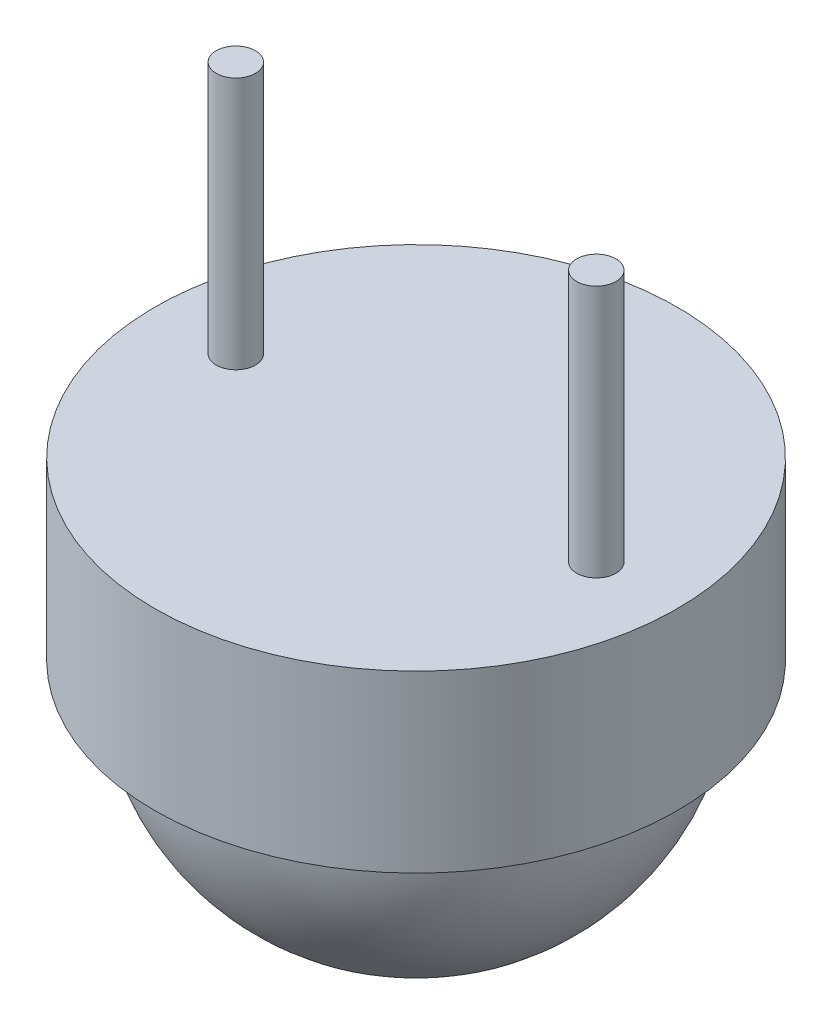
ISO-10303-21;
HEADER;
FILE_DESCRIPTION(('STEP AP214'),'2;1');
FILE_NAME('part.step','',(''),(''),'','','');
FILE_SCHEMA(('AUTOMOTIVE_DESIGN { 1 0 10303 214 1 1 1 1 }'));
ENDSEC;
DATA;
#1=APPLICATION_CONTEXT('core data for automotive mechanical design processes');
#2=APPLICATION_PROTOCOL_DEFINITION('international standard','automotive_design',2000,#1);
#3=PRODUCT_CONTEXT('',#1,'mechanical');
#4=PRODUCT('Part','Part','',(#3));
#5=PRODUCT_RELATED_PRODUCT_CATEGORY('part','',(#4));
#6=PRODUCT_DEFINITION_FORMATION('','',#4);
#7=PRODUCT_DEFINITION_CONTEXT('part definition',#1,'design');
#8=PRODUCT_DEFINITION('design','',#6,#7);
#9=PRODUCT_DEFINITION_SHAPE('','',#8);
#10=(LENGTH_UNIT() NAMED_UNIT(*) SI_UNIT(.MILLI.,.METRE.));
#11=(NAMED_UNIT(*) PLANE_ANGLE_UNIT() SI_UNIT($,.RADIAN.));
#12=(NAMED_UNIT(*) SI_UNIT($,.STERADIAN.) SOLID_ANGLE_UNIT());
#13=UNCERTAINTY_MEASURE_WITH_UNIT(LENGTH_MEASURE(1.E-05),#10,'distance_accuracy_value','');
#14=(GEOMETRIC_REPRESENTATION_CONTEXT(3) GLOBAL_UNCERTAINTY_ASSIGNED_CONTEXT((#13)) GLOBAL_UNIT_ASSIGNED_CONTEXT((#10,
#11,#12)) REPRESENTATION_CONTEXT('',''));
#15=CARTESIAN_POINT('',(0.,0.,0.));
#16=DIRECTION('',(0.,0.,1.));
#17=DIRECTION('',(1.,0.,0.));
#18=AXIS2_PLACEMENT_3D('',#15,#16,#17);
#19=CARTESIAN_POINT('',(0.,7.4,0.));
#20=DIRECTION('',(0.,-1.,0.));
#21=DIRECTION('',(0.,0.,-1.));
#22=AXIS2_PLACEMENT_3D('',#19,#20,#21);
#23=CYLINDRICAL_SURFACE('',#22,11.05);
#24=CARTESIAN_POINT('',(0.,7.4,0.));
#25=DIRECTION('',(0.,1.,0.));
#26=DIRECTION('',(0.,0.,1.));
#27=AXIS2_PLACEMENT_3D('',#24,#25,#26);
#28=CIRCLE('',#27,11.05);
#29=CARTESIAN_POINT('',(0.,7.4,11.05));
#30=VERTEX_POINT('',#29);
#31=EDGE_CURVE('E41',#30,#30,#28,.T.);
#32=ORIENTED_EDGE('',*,*,#31,.F.);
#33=EDGE_LOOP('',(#32));
#34=FACE_BOUND('',#33,.T.);
#35=CARTESIAN_POINT('',(0.,0.,0.));
#36=DIRECTION('',(0.,1.,0.));
#37=DIRECTION('',(0.,0.,1.));
#38=AXIS2_PLACEMENT_3D('',#35,#36,#37);
#39=CIRCLE('',#38,11.05);
#40=CARTESIAN_POINT('',(0.,0.,11.05));
#41=VERTEX_POINT('',#40);
#42=EDGE_CURVE('E45',#41,#41,#39,.T.);
#43=ORIENTED_EDGE('',*,*,#42,.T.);
#44=EDGE_LOOP('',(#43));
#45=FACE_BOUND('',#44,.T.);
#46=ADVANCED_FACE('F35',(#34,#45),#23,.T.);
#47=CARTESIAN_POINT('',(0.,7.4,0.));
#48=DIRECTION('',(0.,1.,0.));
#49=DIRECTION('',(0.,0.,1.));
#50=AXIS2_PLACEMENT_3D('',#47,#48,#49);
#51=PLANE('',#50);
#52=CARTESIAN_POINT('',(-7.625,7.4,0.));
#53=DIRECTION('',(0.,1.,0.));
#54=DIRECTION('',(0.,0.,1.));
#55=AXIS2_PLACEMENT_3D('',#52,#53,#54);
#56=CIRCLE('',#55,0.830000000000001);
#57=CARTESIAN_POINT('',(-7.625,7.4,0.830000000000001));
#58=VERTEX_POINT('',#57);
#59=EDGE_CURVE('E10',#58,#58,#56,.T.);
#60=ORIENTED_EDGE('',*,*,#59,.F.);
#61=EDGE_LOOP('',(#60));
#62=FACE_BOUND('',#61,.T.);
#63=CARTESIAN_POINT('',(7.625,7.4,0.));
#64=DIRECTION('',(0.,1.,0.));
#65=DIRECTION('',(0.,0.,1.));
#66=AXIS2_PLACEMENT_3D('',#63,#64,#65);
#67=CIRCLE('',#66,0.830000000000001);
#68=CARTESIAN_POINT('',(7.625,7.4,0.830000000000001));
#69=VERTEX_POINT('',#68);
#70=EDGE_CURVE('E55',#69,#69,#67,.T.);
#71=ORIENTED_EDGE('',*,*,#70,.F.);
#72=EDGE_LOOP('',(#71));
#73=FACE_BOUND('',#72,.T.);
#74=ORIENTED_EDGE('',*,*,#31,.T.);
#75=EDGE_LOOP('',(#74));
#76=FACE_BOUND('',#75,.T.);
#77=ADVANCED_FACE('F75',(#62,#73,#76),#51,.T.);
#78=CARTESIAN_POINT('',(0.,0.,0.));
#79=DIRECTION('',(0.,1.,0.));
#80=DIRECTION('',(0.,0.,1.));
#81=AXIS2_PLACEMENT_3D('',#78,#79,#80);
#82=PLANE('',#81);
#83=CARTESIAN_POINT('',(0.,0.,0.));
#84=DIRECTION('',(0.,-1.,0.));
#85=DIRECTION('',(0.,0.,-1.));
#86=AXIS2_PLACEMENT_3D('',#83,#84,#85);
#87=CIRCLE('',#86,9.525);
#88=CARTESIAN_POINT('',(0.,0.,-9.525));
#89=VERTEX_POINT('',#88);
#90=EDGE_CURVE('E50',#89,#89,#87,.T.);
#91=ORIENTED_EDGE('',*,*,#90,.F.);
#92=EDGE_LOOP('',(#91));
#93=FACE_BOUND('',#92,.T.);
#94=ORIENTED_EDGE('',*,*,#42,.F.);
#95=EDGE_LOOP('',(#94));
#96=FACE_BOUND('',#95,.T.);
#97=ADVANCED_FACE('F81',(#93,#96),#82,.F.);
#98=CARTESIAN_POINT('',(0.,0.,0.));
#99=DIRECTION('',(0.,-1.,0.));
#100=DIRECTION('',(0.,0.,-1.));
#101=AXIS2_PLACEMENT_3D('',#98,#99,#100);
#102=SPHERICAL_SURFACE('',#101,9.525);
#103=ORIENTED_EDGE('',*,*,#90,.T.);
#104=EDGE_LOOP('',(#103));
#105=FACE_BOUND('',#104,.T.);
#106=ADVANCED_FACE('F88',(#105),#102,.T.);
#107=CARTESIAN_POINT('',(7.625,18.09,0.));
#108=DIRECTION('',(0.,-1.,0.));
#109=DIRECTION('',(0.,0.,-1.));
#110=AXIS2_PLACEMENT_3D('',#107,#108,#109);
#111=CYLINDRICAL_SURFACE('',#110,0.830000000000001);
#112=CARTESIAN_POINT('',(7.625,18.09,0.));
#113=DIRECTION('',(0.,1.,0.));
#114=DIRECTION('',(0.,0.,1.));
#115=AXIS2_PLACEMENT_3D('',#112,#113,#114);
#116=CIRCLE('',#115,0.830000000000001);
#117=CARTESIAN_POINT('',(7.625,18.09,0.830000000000001));
#118=VERTEX_POINT('',#117);
#119=EDGE_CURVE('E54',#118,#118,#116,.T.);
#120=ORIENTED_EDGE('',*,*,#119,.F.);
#121=EDGE_LOOP('',(#120));
#122=FACE_BOUND('',#121,.T.);
#123=ORIENTED_EDGE('',*,*,#70,.T.);
#124=EDGE_LOOP('',(#123));
#125=FACE_BOUND('',#124,.T.);
#126=ADVANCED_FACE('F94',(#122,#125),#111,.T.);
#127=CARTESIAN_POINT('',(7.625,18.09,0.));
#128=DIRECTION('',(0.,1.,0.));
#129=DIRECTION('',(0.,0.,1.));
#130=AXIS2_PLACEMENT_3D('',#127,#128,#129);
#131=PLANE('',#130);
#132=ORIENTED_EDGE('',*,*,#119,.T.);
#133=EDGE_LOOP('',(#132));
#134=FACE_BOUND('',#133,.T.);
#135=ADVANCED_FACE('F72',(#134),#131,.T.);
#136=CARTESIAN_POINT('',(-7.625,18.09,0.));
#137=DIRECTION('',(0.,-1.,0.));
#138=DIRECTION('',(0.,0.,-1.));
#139=AXIS2_PLACEMENT_3D('',#136,#137,#138);
#140=CYLINDRICAL_SURFACE('',#139,0.830000000000001);
#141=CARTESIAN_POINT('',(-7.625,18.09,0.));
#142=DIRECTION('',(0.,-1.,0.));
#143=DIRECTION('',(0.,0.,1.));
#144=AXIS2_PLACEMENT_3D('',#141,#142,#143);
#145=CIRCLE('',#144,0.830000000000001);
#146=CARTESIAN_POINT('',(-7.625,18.09,0.830000000000001));
#147=VERTEX_POINT('',#146);
#148=EDGE_CURVE('E58',#147,#147,#145,.T.);
#149=ORIENTED_EDGE('',*,*,#148,.T.);
#150=EDGE_LOOP('',(#149));
#151=FACE_BOUND('',#150,.T.);
#152=ORIENTED_EDGE('',*,*,#59,.T.);
#153=EDGE_LOOP('',(#152));
#154=FACE_BOUND('',#153,.T.);
#155=ADVANCED_FACE('F64',(#151,#154),#140,.T.);
#156=CARTESIAN_POINT('',(-7.625,18.09,0.));
#157=DIRECTION('',(0.,1.,0.));
#158=DIRECTION('',(0.,0.,1.));
#159=AXIS2_PLACEMENT_3D('',#156,#157,#158);
#160=PLANE('',#159);
#161=ORIENTED_EDGE('',*,*,#148,.F.);
#162=EDGE_LOOP('',(#161));
#163=FACE_BOUND('',#162,.T.);
#164=ADVANCED_FACE('F66',(#163),#160,.T.);
#165=CLOSED_SHELL('',(#46,#77,#97,#106,#126,#135,#155,#164));
#166=MANIFOLD_SOLID_BREP('B2',#165);
#167=ADVANCED_BREP_SHAPE_REPRESENTATION('',(#18,#166),#14);
#168=SHAPE_DEFINITION_REPRESENTATION(#9,#167);
ENDSEC;
END-ISO-10303-21;
